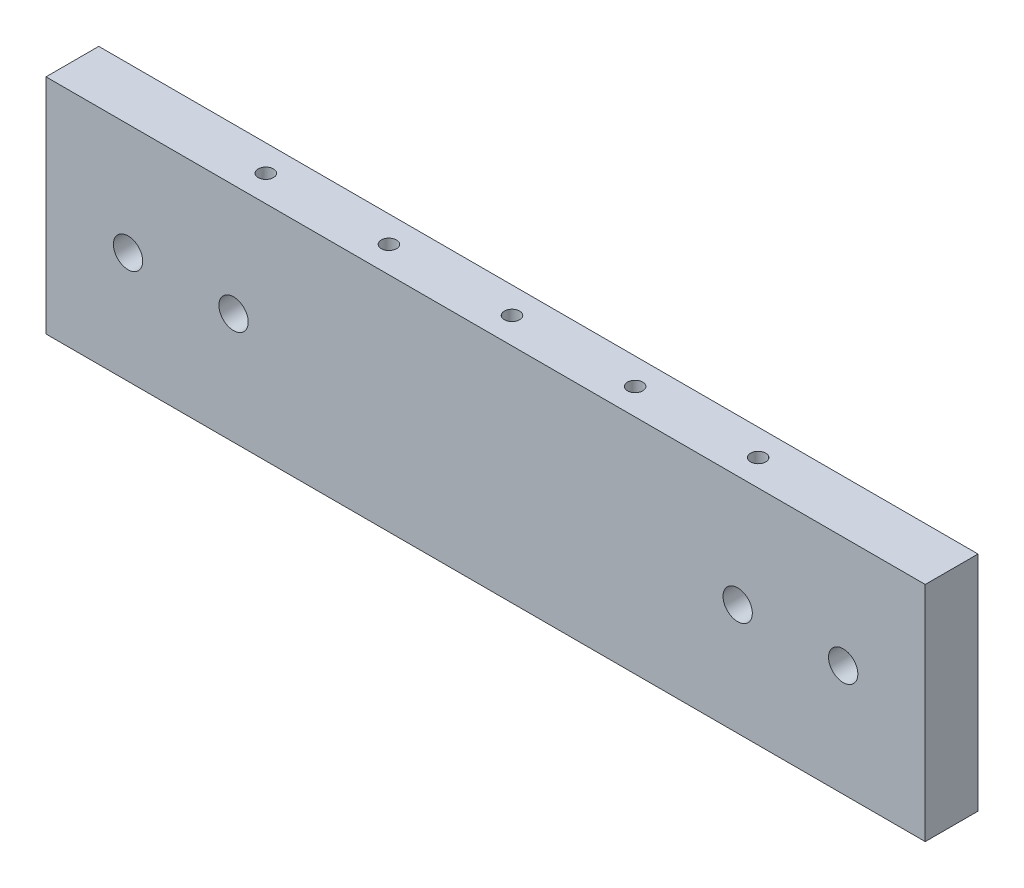
ISO-10303-21;
HEADER;
FILE_DESCRIPTION(('STEP AP214'),'2;1');
FILE_NAME('part.step','',(''),(''),'','','');
FILE_SCHEMA(('AUTOMOTIVE_DESIGN { 1 0 10303 214 1 1 1 1 }'));
ENDSEC;
DATA;
#1=APPLICATION_CONTEXT('core data for automotive mechanical design processes');
#2=APPLICATION_PROTOCOL_DEFINITION('international standard','automotive_design',2000,#1);
#3=PRODUCT_CONTEXT('',#1,'mechanical');
#4=PRODUCT('Part','Part','',(#3));
#5=PRODUCT_RELATED_PRODUCT_CATEGORY('part','',(#4));
#6=PRODUCT_DEFINITION_FORMATION('','',#4);
#7=PRODUCT_DEFINITION_CONTEXT('part definition',#1,'design');
#8=PRODUCT_DEFINITION('design','',#6,#7);
#9=PRODUCT_DEFINITION_SHAPE('','',#8);
#10=(LENGTH_UNIT() NAMED_UNIT(*) SI_UNIT(.MILLI.,.METRE.));
#11=(NAMED_UNIT(*) PLANE_ANGLE_UNIT() SI_UNIT($,.RADIAN.));
#12=(NAMED_UNIT(*) SI_UNIT($,.STERADIAN.) SOLID_ANGLE_UNIT());
#13=UNCERTAINTY_MEASURE_WITH_UNIT(LENGTH_MEASURE(1.E-05),#10,'distance_accuracy_value','');
#14=(GEOMETRIC_REPRESENTATION_CONTEXT(3) GLOBAL_UNCERTAINTY_ASSIGNED_CONTEXT((#13)) GLOBAL_UNIT_ASSIGNED_CONTEXT((#10,
#11,#12)) REPRESENTATION_CONTEXT('',''));
#15=CARTESIAN_POINT('',(0.,0.,0.));
#16=DIRECTION('',(0.,0.,1.));
#17=DIRECTION('',(1.,0.,0.));
#18=AXIS2_PLACEMENT_3D('',#15,#16,#17);
#19=CARTESIAN_POINT('',(42.,11.,4.5));
#20=DIRECTION('',(0.,1.,0.));
#21=DIRECTION('',(0.,0.,1.));
#22=AXIS2_PLACEMENT_3D('',#19,#20,#21);
#23=PLANE('',#22);
#24=CARTESIAN_POINT('',(42.,11.,4.5));
#25=DIRECTION('',(0.,1.,0.));
#26=DIRECTION('',(0.,0.,1.));
#27=AXIS2_PLACEMENT_3D('',#24,#25,#26);
#28=CIRCLE('',#27,1.3);
#29=CARTESIAN_POINT('',(42.,11.,5.8));
#30=VERTEX_POINT('',#29);
#31=EDGE_CURVE('E11',#30,#30,#28,.T.);
#32=ORIENTED_EDGE('',*,*,#31,.T.);
#33=EDGE_LOOP('',(#32));
#34=FACE_BOUND('',#33,.T.);
#35=ADVANCED_FACE('F36',(#34),#23,.T.);
#36=CARTESIAN_POINT('',(42.,11.,4.5));
#37=DIRECTION('',(0.,1.,0.));
#38=DIRECTION('',(0.,0.,1.));
#39=AXIS2_PLACEMENT_3D('',#36,#37,#38);
#40=CYLINDRICAL_SURFACE('',#39,1.3);
#41=ORIENTED_EDGE('',*,*,#31,.F.);
#42=EDGE_LOOP('',(#41));
#43=FACE_BOUND('',#42,.T.);
#44=CARTESIAN_POINT('',(42.,19.,4.5));
#45=DIRECTION('',(0.,1.,0.));
#46=DIRECTION('',(0.,0.,1.));
#47=AXIS2_PLACEMENT_3D('',#44,#45,#46);
#48=CIRCLE('',#47,1.3);
#49=CARTESIAN_POINT('',(42.,19.,5.8));
#50=VERTEX_POINT('',#49);
#51=EDGE_CURVE('E44',#50,#50,#48,.T.);
#52=ORIENTED_EDGE('',*,*,#51,.T.);
#53=EDGE_LOOP('',(#52));
#54=FACE_BOUND('',#53,.T.);
#55=ADVANCED_FACE('F128',(#43,#54),#40,.F.);
#56=CARTESIAN_POINT('',(21.,11.,4.5));
#57=DIRECTION('',(0.,1.,0.));
#58=DIRECTION('',(0.,0.,1.));
#59=AXIS2_PLACEMENT_3D('',#56,#57,#58);
#60=PLANE('',#59);
#61=CARTESIAN_POINT('',(21.,11.,4.5));
#62=DIRECTION('',(0.,1.,0.));
#63=DIRECTION('',(0.,0.,1.));
#64=AXIS2_PLACEMENT_3D('',#61,#62,#63);
#65=CIRCLE('',#64,1.3);
#66=CARTESIAN_POINT('',(21.,11.,5.8));
#67=VERTEX_POINT('',#66);
#68=EDGE_CURVE('E123',#67,#67,#65,.T.);
#69=ORIENTED_EDGE('',*,*,#68,.T.);
#70=EDGE_LOOP('',(#69));
#71=FACE_BOUND('',#70,.T.);
#72=ADVANCED_FACE('F150',(#71),#60,.T.);
#73=CARTESIAN_POINT('',(21.,11.,4.5));
#74=DIRECTION('',(0.,1.,0.));
#75=DIRECTION('',(0.,0.,1.));
#76=AXIS2_PLACEMENT_3D('',#73,#74,#75);
#77=CYLINDRICAL_SURFACE('',#76,1.3);
#78=ORIENTED_EDGE('',*,*,#68,.F.);
#79=EDGE_LOOP('',(#78));
#80=FACE_BOUND('',#79,.T.);
#81=CARTESIAN_POINT('',(21.,19.,4.5));
#82=DIRECTION('',(0.,1.,0.));
#83=DIRECTION('',(0.,0.,1.));
#84=AXIS2_PLACEMENT_3D('',#81,#82,#83);
#85=CIRCLE('',#84,1.3);
#86=CARTESIAN_POINT('',(21.,19.,5.8));
#87=VERTEX_POINT('',#86);
#88=EDGE_CURVE('E120',#87,#87,#85,.T.);
#89=ORIENTED_EDGE('',*,*,#88,.T.);
#90=EDGE_LOOP('',(#89));
#91=FACE_BOUND('',#90,.T.);
#92=ADVANCED_FACE('F156',(#80,#91),#77,.F.);
#93=CARTESIAN_POINT('',(0.,11.,4.5));
#94=DIRECTION('',(0.,1.,0.));
#95=DIRECTION('',(0.,0.,1.));
#96=AXIS2_PLACEMENT_3D('',#93,#94,#95);
#97=PLANE('',#96);
#98=CARTESIAN_POINT('',(0.,11.,4.5));
#99=DIRECTION('',(0.,1.,0.));
#100=DIRECTION('',(0.,0.,1.));
#101=AXIS2_PLACEMENT_3D('',#98,#99,#100);
#102=CIRCLE('',#101,1.3);
#103=CARTESIAN_POINT('',(0.,11.,5.8));
#104=VERTEX_POINT('',#103);
#105=EDGE_CURVE('E117',#104,#104,#102,.T.);
#106=ORIENTED_EDGE('',*,*,#105,.T.);
#107=EDGE_LOOP('',(#106));
#108=FACE_BOUND('',#107,.T.);
#109=ADVANCED_FACE('F162',(#108),#97,.T.);
#110=CARTESIAN_POINT('',(0.,11.,4.5));
#111=DIRECTION('',(0.,1.,0.));
#112=DIRECTION('',(0.,0.,1.));
#113=AXIS2_PLACEMENT_3D('',#110,#111,#112);
#114=CYLINDRICAL_SURFACE('',#113,1.3);
#115=ORIENTED_EDGE('',*,*,#105,.F.);
#116=EDGE_LOOP('',(#115));
#117=FACE_BOUND('',#116,.T.);
#118=CARTESIAN_POINT('',(0.,19.,4.5));
#119=DIRECTION('',(0.,1.,0.));
#120=DIRECTION('',(0.,0.,1.));
#121=AXIS2_PLACEMENT_3D('',#118,#119,#120);
#122=CIRCLE('',#121,1.3);
#123=CARTESIAN_POINT('',(0.,19.,5.8));
#124=VERTEX_POINT('',#123);
#125=EDGE_CURVE('E114',#124,#124,#122,.T.);
#126=ORIENTED_EDGE('',*,*,#125,.T.);
#127=EDGE_LOOP('',(#126));
#128=FACE_BOUND('',#127,.T.);
#129=ADVANCED_FACE('F140',(#117,#128),#114,.F.);
#130=CARTESIAN_POINT('',(75.,19.,9.));
#131=DIRECTION('',(-1.,0.,0.));
#132=DIRECTION('',(0.,0.,1.));
#133=AXIS2_PLACEMENT_3D('',#130,#131,#132);
#134=PLANE('',#133);
#135=DIRECTION('',(0.,1.,0.));
#136=VECTOR('',#135,1.);
#137=CARTESIAN_POINT('',(75.,19.,0.));
#138=LINE('',#137,#136);
#139=CARTESIAN_POINT('',(75.,-19.,0.));
#140=VERTEX_POINT('',#139);
#141=CARTESIAN_POINT('',(75.,19.,0.));
#142=VERTEX_POINT('',#141);
#143=EDGE_CURVE('E104',#140,#142,#138,.T.);
#144=ORIENTED_EDGE('',*,*,#143,.T.);
#145=DIRECTION('',(0.,0.,-1.));
#146=VECTOR('',#145,1.);
#147=CARTESIAN_POINT('',(75.,19.,9.));
#148=LINE('',#147,#146);
#149=CARTESIAN_POINT('',(75.,19.,9.));
#150=VERTEX_POINT('',#149);
#151=EDGE_CURVE('E95',#150,#142,#148,.T.);
#152=ORIENTED_EDGE('',*,*,#151,.F.);
#153=DIRECTION('',(0.,1.,0.));
#154=VECTOR('',#153,1.);
#155=CARTESIAN_POINT('',(75.,19.,9.));
#156=LINE('',#155,#154);
#157=CARTESIAN_POINT('',(75.,-19.,9.));
#158=VERTEX_POINT('',#157);
#159=EDGE_CURVE('E88',#158,#150,#156,.T.);
#160=ORIENTED_EDGE('',*,*,#159,.F.);
#161=DIRECTION('',(0.,0.,-1.));
#162=VECTOR('',#161,1.);
#163=CARTESIAN_POINT('',(75.,-19.,9.));
#164=LINE('',#163,#162);
#165=EDGE_CURVE('E100',#158,#140,#164,.T.);
#166=ORIENTED_EDGE('',*,*,#165,.T.);
#167=EDGE_LOOP('',(#144,#152,#160,#166));
#168=FACE_BOUND('',#167,.T.);
#169=ADVANCED_FACE('F131',(#168),#134,.F.);
#170=CARTESIAN_POINT('',(-75.,19.,9.));
#171=DIRECTION('',(0.,-1.,0.));
#172=DIRECTION('',(0.,0.,-1.));
#173=AXIS2_PLACEMENT_3D('',#170,#171,#172);
#174=PLANE('',#173);
#175=CARTESIAN_POINT('',(-21.,19.,4.5));
#176=DIRECTION('',(0.,1.,0.));
#177=DIRECTION('',(0.,0.,1.));
#178=AXIS2_PLACEMENT_3D('',#175,#176,#177);
#179=CIRCLE('',#178,1.3);
#180=CARTESIAN_POINT('',(-21.,19.,5.8));
#181=VERTEX_POINT('',#180);
#182=EDGE_CURVE('E442',#181,#181,#179,.T.);
#183=ORIENTED_EDGE('',*,*,#182,.F.);
#184=EDGE_LOOP('',(#183));
#185=FACE_BOUND('',#184,.T.);
#186=CARTESIAN_POINT('',(-42.,19.,4.5));
#187=DIRECTION('',(0.,1.,0.));
#188=DIRECTION('',(0.,0.,1.));
#189=AXIS2_PLACEMENT_3D('',#186,#187,#188);
#190=CIRCLE('',#189,1.3);
#191=CARTESIAN_POINT('',(-42.,19.,5.8));
#192=VERTEX_POINT('',#191);
#193=EDGE_CURVE('E453',#192,#192,#190,.T.);
#194=ORIENTED_EDGE('',*,*,#193,.F.);
#195=EDGE_LOOP('',(#194));
#196=FACE_BOUND('',#195,.T.);
#197=DIRECTION('',(-1.,0.,0.));
#198=VECTOR('',#197,1.);
#199=CARTESIAN_POINT('',(-75.,19.,0.));
#200=LINE('',#199,#198);
#201=CARTESIAN_POINT('',(-75.,19.,0.));
#202=VERTEX_POINT('',#201);
#203=EDGE_CURVE('E94',#142,#202,#200,.T.);
#204=ORIENTED_EDGE('',*,*,#203,.T.);
#205=DIRECTION('',(0.,0.,-1.));
#206=VECTOR('',#205,1.);
#207=CARTESIAN_POINT('',(-75.,19.,9.));
#208=LINE('',#207,#206);
#209=CARTESIAN_POINT('',(-75.,19.,9.));
#210=VERTEX_POINT('',#209);
#211=EDGE_CURVE('E91',#210,#202,#208,.T.);
#212=ORIENTED_EDGE('',*,*,#211,.F.);
#213=DIRECTION('',(-1.,0.,0.));
#214=VECTOR('',#213,1.);
#215=CARTESIAN_POINT('',(-75.,19.,9.));
#216=LINE('',#215,#214);
#217=EDGE_CURVE('E83',#150,#210,#216,.T.);
#218=ORIENTED_EDGE('',*,*,#217,.F.);
#219=ORIENTED_EDGE('',*,*,#151,.T.);
#220=EDGE_LOOP('',(#204,#212,#218,#219));
#221=FACE_BOUND('',#220,.T.);
#222=ORIENTED_EDGE('',*,*,#125,.F.);
#223=EDGE_LOOP('',(#222));
#224=FACE_BOUND('',#223,.T.);
#225=ORIENTED_EDGE('',*,*,#88,.F.);
#226=EDGE_LOOP('',(#225));
#227=FACE_BOUND('',#226,.T.);
#228=ORIENTED_EDGE('',*,*,#51,.F.);
#229=EDGE_LOOP('',(#228));
#230=FACE_BOUND('',#229,.T.);
#231=ADVANCED_FACE('F92',(#185,#196,#221,#224,#227,#230),#174,.F.);
#232=CARTESIAN_POINT('',(-75.,19.,9.));
#233=DIRECTION('',(1.,0.,0.));
#234=DIRECTION('',(0.,0.,-1.));
#235=AXIS2_PLACEMENT_3D('',#232,#233,#234);
#236=PLANE('',#235);
#237=DIRECTION('',(0.,-1.,0.));
#238=VECTOR('',#237,1.);
#239=CARTESIAN_POINT('',(-75.,19.,0.));
#240=LINE('',#239,#238);
#241=CARTESIAN_POINT('',(-75.,-19.,0.));
#242=VERTEX_POINT('',#241);
#243=EDGE_CURVE('E69',#202,#242,#240,.T.);
#244=ORIENTED_EDGE('',*,*,#243,.T.);
#245=DIRECTION('',(0.,0.,-1.));
#246=VECTOR('',#245,1.);
#247=CARTESIAN_POINT('',(-75.,-19.,9.));
#248=LINE('',#247,#246);
#249=CARTESIAN_POINT('',(-75.,-19.,9.));
#250=VERTEX_POINT('',#249);
#251=EDGE_CURVE('E96',#250,#242,#248,.T.);
#252=ORIENTED_EDGE('',*,*,#251,.F.);
#253=DIRECTION('',(0.,-1.,0.));
#254=VECTOR('',#253,1.);
#255=CARTESIAN_POINT('',(-75.,19.,9.));
#256=LINE('',#255,#254);
#257=EDGE_CURVE('E86',#210,#250,#256,.T.);
#258=ORIENTED_EDGE('',*,*,#257,.F.);
#259=ORIENTED_EDGE('',*,*,#211,.T.);
#260=EDGE_LOOP('',(#244,#252,#258,#259));
#261=FACE_BOUND('',#260,.T.);
#262=ADVANCED_FACE('F98',(#261),#236,.F.);
#263=CARTESIAN_POINT('',(-75.,-19.,9.));
#264=DIRECTION('',(0.,1.,0.));
#265=DIRECTION('',(0.,0.,1.));
#266=AXIS2_PLACEMENT_3D('',#263,#264,#265);
#267=PLANE('',#266);
#268=CARTESIAN_POINT('',(-21.,-19.,4.5));
#269=DIRECTION('',(0.,1.,0.));
#270=DIRECTION('',(0.,0.,1.));
#271=AXIS2_PLACEMENT_3D('',#268,#269,#270);
#272=CIRCLE('',#271,1.3);
#273=CARTESIAN_POINT('',(-21.,-19.,5.8));
#274=VERTEX_POINT('',#273);
#275=EDGE_CURVE('E421',#274,#274,#272,.T.);
#276=ORIENTED_EDGE('',*,*,#275,.T.);
#277=EDGE_LOOP('',(#276));
#278=FACE_BOUND('',#277,.T.);
#279=CARTESIAN_POINT('',(0.,-19.,4.5));
#280=DIRECTION('',(0.,1.,0.));
#281=DIRECTION('',(0.,0.,1.));
#282=AXIS2_PLACEMENT_3D('',#279,#280,#281);
#283=CIRCLE('',#282,1.3);
#284=CARTESIAN_POINT('',(0.,-19.,5.8));
#285=VERTEX_POINT('',#284);
#286=EDGE_CURVE('E425',#285,#285,#283,.T.);
#287=ORIENTED_EDGE('',*,*,#286,.T.);
#288=EDGE_LOOP('',(#287));
#289=FACE_BOUND('',#288,.T.);
#290=CARTESIAN_POINT('',(21.,-19.,4.5));
#291=DIRECTION('',(0.,1.,0.));
#292=DIRECTION('',(0.,0.,1.));
#293=AXIS2_PLACEMENT_3D('',#290,#291,#292);
#294=CIRCLE('',#293,1.3);
#295=CARTESIAN_POINT('',(21.,-19.,5.8));
#296=VERTEX_POINT('',#295);
#297=EDGE_CURVE('E429',#296,#296,#294,.T.);
#298=ORIENTED_EDGE('',*,*,#297,.T.);
#299=EDGE_LOOP('',(#298));
#300=FACE_BOUND('',#299,.T.);
#301=CARTESIAN_POINT('',(42.,-19.,4.5));
#302=DIRECTION('',(0.,1.,0.));
#303=DIRECTION('',(0.,0.,1.));
#304=AXIS2_PLACEMENT_3D('',#301,#302,#303);
#305=CIRCLE('',#304,1.3);
#306=CARTESIAN_POINT('',(42.,-19.,5.8));
#307=VERTEX_POINT('',#306);
#308=EDGE_CURVE('E433',#307,#307,#305,.T.);
#309=ORIENTED_EDGE('',*,*,#308,.T.);
#310=EDGE_LOOP('',(#309));
#311=FACE_BOUND('',#310,.T.);
#312=CARTESIAN_POINT('',(-42.,-19.,4.5));
#313=DIRECTION('',(0.,1.,0.));
#314=DIRECTION('',(0.,0.,1.));
#315=AXIS2_PLACEMENT_3D('',#312,#313,#314);
#316=CIRCLE('',#315,1.3);
#317=CARTESIAN_POINT('',(-42.,-19.,5.8));
#318=VERTEX_POINT('',#317);
#319=EDGE_CURVE('E436',#318,#318,#316,.T.);
#320=ORIENTED_EDGE('',*,*,#319,.T.);
#321=EDGE_LOOP('',(#320));
#322=FACE_BOUND('',#321,.T.);
#323=DIRECTION('',(1.,0.,0.));
#324=VECTOR('',#323,1.);
#325=CARTESIAN_POINT('',(-75.,-19.,0.));
#326=LINE('',#325,#324);
#327=EDGE_CURVE('E75',#242,#140,#326,.T.);
#328=ORIENTED_EDGE('',*,*,#327,.T.);
#329=ORIENTED_EDGE('',*,*,#165,.F.);
#330=DIRECTION('',(1.,0.,0.));
#331=VECTOR('',#330,1.);
#332=CARTESIAN_POINT('',(-75.,-19.,9.));
#333=LINE('',#332,#331);
#334=EDGE_CURVE('E52',#250,#158,#333,.T.);
#335=ORIENTED_EDGE('',*,*,#334,.F.);
#336=ORIENTED_EDGE('',*,*,#251,.T.);
#337=EDGE_LOOP('',(#328,#329,#335,#336));
#338=FACE_BOUND('',#337,.T.);
#339=ADVANCED_FACE('F138',(#278,#289,#300,#311,#322,#338),#267,.F.);
#340=CARTESIAN_POINT('',(0.,0.,9.));
#341=DIRECTION('',(0.,0.,1.));
#342=DIRECTION('',(1.,0.,0.));
#343=AXIS2_PLACEMENT_3D('',#340,#341,#342);
#344=PLANE('',#343);
#345=CARTESIAN_POINT('',(61.,0.,9.));
#346=DIRECTION('',(0.,0.,-1.));
#347=DIRECTION('',(-1.,0.,0.));
#348=AXIS2_PLACEMENT_3D('',#345,#346,#347);
#349=CIRCLE('',#348,2.5);
#350=CARTESIAN_POINT('',(58.5,0.,9.));
#351=VERTEX_POINT('',#350);
#352=EDGE_CURVE('E483',#351,#351,#349,.T.);
#353=ORIENTED_EDGE('',*,*,#352,.T.);
#354=EDGE_LOOP('',(#353));
#355=FACE_BOUND('',#354,.T.);
#356=CARTESIAN_POINT('',(43.,0.,9.));
#357=DIRECTION('',(0.,0.,-1.));
#358=DIRECTION('',(-1.,0.,0.));
#359=AXIS2_PLACEMENT_3D('',#356,#357,#358);
#360=CIRCLE('',#359,2.5);
#361=CARTESIAN_POINT('',(40.5,0.,9.));
#362=VERTEX_POINT('',#361);
#363=EDGE_CURVE('E491',#362,#362,#360,.T.);
#364=ORIENTED_EDGE('',*,*,#363,.T.);
#365=EDGE_LOOP('',(#364));
#366=FACE_BOUND('',#365,.T.);
#367=CARTESIAN_POINT('',(-61.,0.,9.));
#368=DIRECTION('',(0.,0.,1.));
#369=DIRECTION('',(1.,0.,0.));
#370=AXIS2_PLACEMENT_3D('',#367,#368,#369);
#371=CIRCLE('',#370,2.5);
#372=CARTESIAN_POINT('',(-58.5,0.,9.));
#373=VERTEX_POINT('',#372);
#374=EDGE_CURVE('E479',#373,#373,#371,.T.);
#375=ORIENTED_EDGE('',*,*,#374,.F.);
#376=EDGE_LOOP('',(#375));
#377=FACE_BOUND('',#376,.T.);
#378=CARTESIAN_POINT('',(-43.,0.,9.));
#379=DIRECTION('',(0.,0.,1.));
#380=DIRECTION('',(1.,0.,0.));
#381=AXIS2_PLACEMENT_3D('',#378,#379,#380);
#382=CIRCLE('',#381,2.5);
#383=CARTESIAN_POINT('',(-40.5,0.,9.));
#384=VERTEX_POINT('',#383);
#385=EDGE_CURVE('E480',#384,#384,#382,.T.);
#386=ORIENTED_EDGE('',*,*,#385,.F.);
#387=EDGE_LOOP('',(#386));
#388=FACE_BOUND('',#387,.T.);
#389=ORIENTED_EDGE('',*,*,#159,.T.);
#390=ORIENTED_EDGE('',*,*,#217,.T.);
#391=ORIENTED_EDGE('',*,*,#257,.T.);
#392=ORIENTED_EDGE('',*,*,#334,.T.);
#393=EDGE_LOOP('',(#389,#390,#391,#392));
#394=FACE_BOUND('',#393,.T.);
#395=ADVANCED_FACE('F84',(#355,#366,#377,#388,#394),#344,.T.);
#396=CARTESIAN_POINT('',(0.,0.,0.));
#397=DIRECTION('',(0.,0.,1.));
#398=DIRECTION('',(1.,0.,0.));
#399=AXIS2_PLACEMENT_3D('',#396,#397,#398);
#400=PLANE('',#399);
#401=CARTESIAN_POINT('',(61.,0.,0.));
#402=DIRECTION('',(0.,0.,1.));
#403=DIRECTION('',(1.,0.,0.));
#404=AXIS2_PLACEMENT_3D('',#401,#402,#403);
#405=CIRCLE('',#404,2.5);
#406=CARTESIAN_POINT('',(63.5,0.,0.));
#407=VERTEX_POINT('',#406);
#408=EDGE_CURVE('E494',#407,#407,#405,.T.);
#409=ORIENTED_EDGE('',*,*,#408,.T.);
#410=EDGE_LOOP('',(#409));
#411=FACE_BOUND('',#410,.T.);
#412=CARTESIAN_POINT('',(43.,0.,0.));
#413=DIRECTION('',(0.,0.,1.));
#414=DIRECTION('',(1.,0.,0.));
#415=AXIS2_PLACEMENT_3D('',#412,#413,#414);
#416=CIRCLE('',#415,2.5);
#417=CARTESIAN_POINT('',(45.5,0.,0.));
#418=VERTEX_POINT('',#417);
#419=EDGE_CURVE('E488',#418,#418,#416,.T.);
#420=ORIENTED_EDGE('',*,*,#419,.T.);
#421=EDGE_LOOP('',(#420));
#422=FACE_BOUND('',#421,.T.);
#423=CARTESIAN_POINT('',(-61.,0.,0.));
#424=DIRECTION('',(0.,0.,1.));
#425=DIRECTION('',(1.,0.,0.));
#426=AXIS2_PLACEMENT_3D('',#423,#424,#425);
#427=CIRCLE('',#426,2.5);
#428=CARTESIAN_POINT('',(-58.5,0.,0.));
#429=VERTEX_POINT('',#428);
#430=EDGE_CURVE('E464',#429,#429,#427,.F.);
#431=ORIENTED_EDGE('',*,*,#430,.F.);
#432=EDGE_LOOP('',(#431));
#433=FACE_BOUND('',#432,.T.);
#434=CARTESIAN_POINT('',(-43.,0.,0.));
#435=DIRECTION('',(0.,0.,1.));
#436=DIRECTION('',(1.,0.,0.));
#437=AXIS2_PLACEMENT_3D('',#434,#435,#436);
#438=CIRCLE('',#437,2.5);
#439=CARTESIAN_POINT('',(-40.5,0.,0.));
#440=VERTEX_POINT('',#439);
#441=EDGE_CURVE('E476',#440,#440,#438,.F.);
#442=ORIENTED_EDGE('',*,*,#441,.F.);
#443=EDGE_LOOP('',(#442));
#444=FACE_BOUND('',#443,.T.);
#445=ORIENTED_EDGE('',*,*,#143,.F.);
#446=ORIENTED_EDGE('',*,*,#327,.F.);
#447=ORIENTED_EDGE('',*,*,#243,.F.);
#448=ORIENTED_EDGE('',*,*,#203,.F.);
#449=EDGE_LOOP('',(#445,#446,#447,#448));
#450=FACE_BOUND('',#449,.T.);
#451=ADVANCED_FACE('F203',(#411,#422,#433,#444,#450),#400,.F.);
#452=CARTESIAN_POINT('',(-42.,11.,4.5));
#453=DIRECTION('',(0.,1.,0.));
#454=DIRECTION('',(0.,0.,1.));
#455=AXIS2_PLACEMENT_3D('',#452,#453,#454);
#456=CYLINDRICAL_SURFACE('',#455,1.3);
#457=CARTESIAN_POINT('',(-42.,11.,4.5));
#458=DIRECTION('',(0.,1.,0.));
#459=DIRECTION('',(0.,0.,1.));
#460=AXIS2_PLACEMENT_3D('',#457,#458,#459);
#461=CIRCLE('',#460,1.3);
#462=CARTESIAN_POINT('',(-42.,11.,5.8));
#463=VERTEX_POINT('',#462);
#464=EDGE_CURVE('E107',#463,#463,#461,.T.);
#465=ORIENTED_EDGE('',*,*,#464,.F.);
#466=EDGE_LOOP('',(#465));
#467=FACE_BOUND('',#466,.T.);
#468=ORIENTED_EDGE('',*,*,#193,.T.);
#469=EDGE_LOOP('',(#468));
#470=FACE_BOUND('',#469,.T.);
#471=ADVANCED_FACE('F197',(#467,#470),#456,.F.);
#472=CARTESIAN_POINT('',(-42.,11.,4.5));
#473=DIRECTION('',(0.,1.,0.));
#474=DIRECTION('',(0.,0.,1.));
#475=AXIS2_PLACEMENT_3D('',#472,#473,#474);
#476=PLANE('',#475);
#477=ORIENTED_EDGE('',*,*,#464,.T.);
#478=EDGE_LOOP('',(#477));
#479=FACE_BOUND('',#478,.T.);
#480=ADVANCED_FACE('F202',(#479),#476,.T.);
#481=CARTESIAN_POINT('',(-21.,11.,4.5));
#482=DIRECTION('',(0.,1.,0.));
#483=DIRECTION('',(0.,0.,1.));
#484=AXIS2_PLACEMENT_3D('',#481,#482,#483);
#485=CYLINDRICAL_SURFACE('',#484,1.3);
#486=CARTESIAN_POINT('',(-21.,11.,4.5));
#487=DIRECTION('',(0.,1.,0.));
#488=DIRECTION('',(0.,0.,1.));
#489=AXIS2_PLACEMENT_3D('',#486,#487,#488);
#490=CIRCLE('',#489,1.3);
#491=CARTESIAN_POINT('',(-21.,11.,5.8));
#492=VERTEX_POINT('',#491);
#493=EDGE_CURVE('E450',#492,#492,#490,.T.);
#494=ORIENTED_EDGE('',*,*,#493,.F.);
#495=EDGE_LOOP('',(#494));
#496=FACE_BOUND('',#495,.T.);
#497=ORIENTED_EDGE('',*,*,#182,.T.);
#498=EDGE_LOOP('',(#497));
#499=FACE_BOUND('',#498,.T.);
#500=ADVANCED_FACE('F214',(#496,#499),#485,.F.);
#501=CARTESIAN_POINT('',(-21.,11.,4.5));
#502=DIRECTION('',(0.,1.,0.));
#503=DIRECTION('',(0.,0.,1.));
#504=AXIS2_PLACEMENT_3D('',#501,#502,#503);
#505=PLANE('',#504);
#506=ORIENTED_EDGE('',*,*,#493,.T.);
#507=EDGE_LOOP('',(#506));
#508=FACE_BOUND('',#507,.T.);
#509=ADVANCED_FACE('F252',(#508),#505,.T.);
#510=CARTESIAN_POINT('',(-42.,-11.,4.5));
#511=DIRECTION('',(0.,-1.,0.));
#512=DIRECTION('',(0.,0.,-1.));
#513=AXIS2_PLACEMENT_3D('',#510,#511,#512);
#514=CYLINDRICAL_SURFACE('',#513,1.3);
#515=CARTESIAN_POINT('',(-42.,-11.,4.5));
#516=DIRECTION('',(0.,1.,0.));
#517=DIRECTION('',(0.,0.,1.));
#518=AXIS2_PLACEMENT_3D('',#515,#516,#517);
#519=CIRCLE('',#518,1.3);
#520=CARTESIAN_POINT('',(-42.,-11.,5.8));
#521=VERTEX_POINT('',#520);
#522=EDGE_CURVE('E438',#521,#521,#519,.T.);
#523=ORIENTED_EDGE('',*,*,#522,.T.);
#524=EDGE_LOOP('',(#523));
#525=FACE_BOUND('',#524,.T.);
#526=ORIENTED_EDGE('',*,*,#319,.F.);
#527=EDGE_LOOP('',(#526));
#528=FACE_BOUND('',#527,.T.);
#529=ADVANCED_FACE('F261',(#525,#528),#514,.F.);
#530=CARTESIAN_POINT('',(-42.,-11.,4.5));
#531=DIRECTION('',(0.,-1.,0.));
#532=DIRECTION('',(0.,0.,1.));
#533=AXIS2_PLACEMENT_3D('',#530,#531,#532);
#534=PLANE('',#533);
#535=ORIENTED_EDGE('',*,*,#522,.F.);
#536=EDGE_LOOP('',(#535));
#537=FACE_BOUND('',#536,.T.);
#538=ADVANCED_FACE('F271',(#537),#534,.T.);
#539=CARTESIAN_POINT('',(42.,-11.,4.5));
#540=DIRECTION('',(0.,-1.,0.));
#541=DIRECTION('',(0.,0.,-1.));
#542=AXIS2_PLACEMENT_3D('',#539,#540,#541);
#543=CYLINDRICAL_SURFACE('',#542,1.3);
#544=CARTESIAN_POINT('',(42.,-11.,4.5));
#545=DIRECTION('',(0.,1.,0.));
#546=DIRECTION('',(0.,0.,1.));
#547=AXIS2_PLACEMENT_3D('',#544,#545,#546);
#548=CIRCLE('',#547,1.3);
#549=CARTESIAN_POINT('',(42.,-11.,5.8));
#550=VERTEX_POINT('',#549);
#551=EDGE_CURVE('E463',#550,#550,#548,.T.);
#552=ORIENTED_EDGE('',*,*,#551,.T.);
#553=EDGE_LOOP('',(#552));
#554=FACE_BOUND('',#553,.T.);
#555=ORIENTED_EDGE('',*,*,#308,.F.);
#556=EDGE_LOOP('',(#555));
#557=FACE_BOUND('',#556,.T.);
#558=ADVANCED_FACE('F280',(#554,#557),#543,.F.);
#559=CARTESIAN_POINT('',(42.,-11.,4.5));
#560=DIRECTION('',(0.,-1.,0.));
#561=DIRECTION('',(0.,0.,1.));
#562=AXIS2_PLACEMENT_3D('',#559,#560,#561);
#563=PLANE('',#562);
#564=ORIENTED_EDGE('',*,*,#551,.F.);
#565=EDGE_LOOP('',(#564));
#566=FACE_BOUND('',#565,.T.);
#567=ADVANCED_FACE('F289',(#566),#563,.T.);
#568=CARTESIAN_POINT('',(21.,-11.,4.5));
#569=DIRECTION('',(0.,-1.,0.));
#570=DIRECTION('',(0.,0.,-1.));
#571=AXIS2_PLACEMENT_3D('',#568,#569,#570);
#572=CYLINDRICAL_SURFACE('',#571,1.3);
#573=CARTESIAN_POINT('',(21.,-11.,4.5));
#574=DIRECTION('',(0.,1.,0.));
#575=DIRECTION('',(0.,0.,1.));
#576=AXIS2_PLACEMENT_3D('',#573,#574,#575);
#577=CIRCLE('',#576,1.3);
#578=CARTESIAN_POINT('',(21.,-11.,5.8));
#579=VERTEX_POINT('',#578);
#580=EDGE_CURVE('E468',#579,#579,#577,.T.);
#581=ORIENTED_EDGE('',*,*,#580,.T.);
#582=EDGE_LOOP('',(#581));
#583=FACE_BOUND('',#582,.T.);
#584=ORIENTED_EDGE('',*,*,#297,.F.);
#585=EDGE_LOOP('',(#584));
#586=FACE_BOUND('',#585,.T.);
#587=ADVANCED_FACE('F298',(#583,#586),#572,.F.);
#588=CARTESIAN_POINT('',(21.,-11.,4.5));
#589=DIRECTION('',(0.,-1.,0.));
#590=DIRECTION('',(0.,0.,1.));
#591=AXIS2_PLACEMENT_3D('',#588,#589,#590);
#592=PLANE('',#591);
#593=ORIENTED_EDGE('',*,*,#580,.F.);
#594=EDGE_LOOP('',(#593));
#595=FACE_BOUND('',#594,.T.);
#596=ADVANCED_FACE('F307',(#595),#592,.T.);
#597=CARTESIAN_POINT('',(0.,-11.,4.5));
#598=DIRECTION('',(0.,-1.,0.));
#599=DIRECTION('',(0.,0.,-1.));
#600=AXIS2_PLACEMENT_3D('',#597,#598,#599);
#601=CYLINDRICAL_SURFACE('',#600,1.3);
#602=CARTESIAN_POINT('',(0.,-11.,4.5));
#603=DIRECTION('',(0.,1.,0.));
#604=DIRECTION('',(0.,0.,1.));
#605=AXIS2_PLACEMENT_3D('',#602,#603,#604);
#606=CIRCLE('',#605,1.3);
#607=CARTESIAN_POINT('',(0.,-11.,5.8));
#608=VERTEX_POINT('',#607);
#609=EDGE_CURVE('E472',#608,#608,#606,.T.);
#610=ORIENTED_EDGE('',*,*,#609,.T.);
#611=EDGE_LOOP('',(#610));
#612=FACE_BOUND('',#611,.T.);
#613=ORIENTED_EDGE('',*,*,#286,.F.);
#614=EDGE_LOOP('',(#613));
#615=FACE_BOUND('',#614,.T.);
#616=ADVANCED_FACE('F316',(#612,#615),#601,.F.);
#617=CARTESIAN_POINT('',(0.,-11.,4.5));
#618=DIRECTION('',(0.,-1.,0.));
#619=DIRECTION('',(0.,0.,1.));
#620=AXIS2_PLACEMENT_3D('',#617,#618,#619);
#621=PLANE('',#620);
#622=ORIENTED_EDGE('',*,*,#609,.F.);
#623=EDGE_LOOP('',(#622));
#624=FACE_BOUND('',#623,.T.);
#625=ADVANCED_FACE('F325',(#624),#621,.T.);
#626=CARTESIAN_POINT('',(-21.,-11.,4.5));
#627=DIRECTION('',(0.,-1.,0.));
#628=DIRECTION('',(0.,0.,-1.));
#629=AXIS2_PLACEMENT_3D('',#626,#627,#628);
#630=CYLINDRICAL_SURFACE('',#629,1.3);
#631=CARTESIAN_POINT('',(-21.,-11.,4.5));
#632=DIRECTION('',(0.,1.,0.));
#633=DIRECTION('',(0.,0.,1.));
#634=AXIS2_PLACEMENT_3D('',#631,#632,#633);
#635=CIRCLE('',#634,1.3);
#636=CARTESIAN_POINT('',(-21.,-11.,5.8));
#637=VERTEX_POINT('',#636);
#638=EDGE_CURVE('E439',#637,#637,#635,.T.);
#639=ORIENTED_EDGE('',*,*,#638,.T.);
#640=EDGE_LOOP('',(#639));
#641=FACE_BOUND('',#640,.T.);
#642=ORIENTED_EDGE('',*,*,#275,.F.);
#643=EDGE_LOOP('',(#642));
#644=FACE_BOUND('',#643,.T.);
#645=ADVANCED_FACE('F334',(#641,#644),#630,.F.);
#646=CARTESIAN_POINT('',(-21.,-11.,4.5));
#647=DIRECTION('',(0.,-1.,0.));
#648=DIRECTION('',(0.,0.,1.));
#649=AXIS2_PLACEMENT_3D('',#646,#647,#648);
#650=PLANE('',#649);
#651=ORIENTED_EDGE('',*,*,#638,.F.);
#652=EDGE_LOOP('',(#651));
#653=FACE_BOUND('',#652,.T.);
#654=ADVANCED_FACE('F343',(#653),#650,.T.);
#655=CARTESIAN_POINT('',(-43.,0.,-0.000999999999999265));
#656=DIRECTION('',(0.,0.,1.));
#657=DIRECTION('',(1.,0.,0.));
#658=AXIS2_PLACEMENT_3D('',#655,#656,#657);
#659=CYLINDRICAL_SURFACE('',#658,2.5);
#660=ORIENTED_EDGE('',*,*,#385,.T.);
#661=EDGE_LOOP('',(#660));
#662=FACE_BOUND('',#661,.T.);
#663=ORIENTED_EDGE('',*,*,#441,.T.);
#664=EDGE_LOOP('',(#663));
#665=FACE_BOUND('',#664,.T.);
#666=ADVANCED_FACE('F352',(#662,#665),#659,.F.);
#667=CARTESIAN_POINT('',(-61.,0.,-0.000999999999999265));
#668=DIRECTION('',(0.,0.,1.));
#669=DIRECTION('',(1.,0.,0.));
#670=AXIS2_PLACEMENT_3D('',#667,#668,#669);
#671=CYLINDRICAL_SURFACE('',#670,2.5);
#672=ORIENTED_EDGE('',*,*,#374,.T.);
#673=EDGE_LOOP('',(#672));
#674=FACE_BOUND('',#673,.T.);
#675=ORIENTED_EDGE('',*,*,#430,.T.);
#676=EDGE_LOOP('',(#675));
#677=FACE_BOUND('',#676,.T.);
#678=ADVANCED_FACE('F361',(#674,#677),#671,.F.);
#679=CARTESIAN_POINT('',(43.,0.,-0.000999999999999265));
#680=DIRECTION('',(0.,0.,1.));
#681=DIRECTION('',(1.,0.,0.));
#682=AXIS2_PLACEMENT_3D('',#679,#680,#681);
#683=CYLINDRICAL_SURFACE('',#682,2.5);
#684=ORIENTED_EDGE('',*,*,#363,.F.);
#685=EDGE_LOOP('',(#684));
#686=FACE_BOUND('',#685,.T.);
#687=ORIENTED_EDGE('',*,*,#419,.F.);
#688=EDGE_LOOP('',(#687));
#689=FACE_BOUND('',#688,.T.);
#690=ADVANCED_FACE('F370',(#686,#689),#683,.F.);
#691=CARTESIAN_POINT('',(61.,0.,-0.000999999999999265));
#692=DIRECTION('',(0.,0.,1.));
#693=DIRECTION('',(1.,0.,0.));
#694=AXIS2_PLACEMENT_3D('',#691,#692,#693);
#695=CYLINDRICAL_SURFACE('',#694,2.5);
#696=ORIENTED_EDGE('',*,*,#352,.F.);
#697=EDGE_LOOP('',(#696));
#698=FACE_BOUND('',#697,.T.);
#699=ORIENTED_EDGE('',*,*,#408,.F.);
#700=EDGE_LOOP('',(#699));
#701=FACE_BOUND('',#700,.T.);
#702=ADVANCED_FACE('F380',(#698,#701),#695,.F.);
#703=CLOSED_SHELL('',(#35,#55,#72,#92,#109,#129,#169,#231,#262,#339,#395,#451,#471,#480,#500,
#509,#529,#538,#558,#567,#587,#596,#616,#625,#645,#654,#666,#678,#690,#702));
#704=MANIFOLD_SOLID_BREP('B2',#703);
#705=ADVANCED_BREP_SHAPE_REPRESENTATION('',(#18,#704),#14);
#706=SHAPE_DEFINITION_REPRESENTATION(#9,#705);
ENDSEC;
END-ISO-10303-21;
